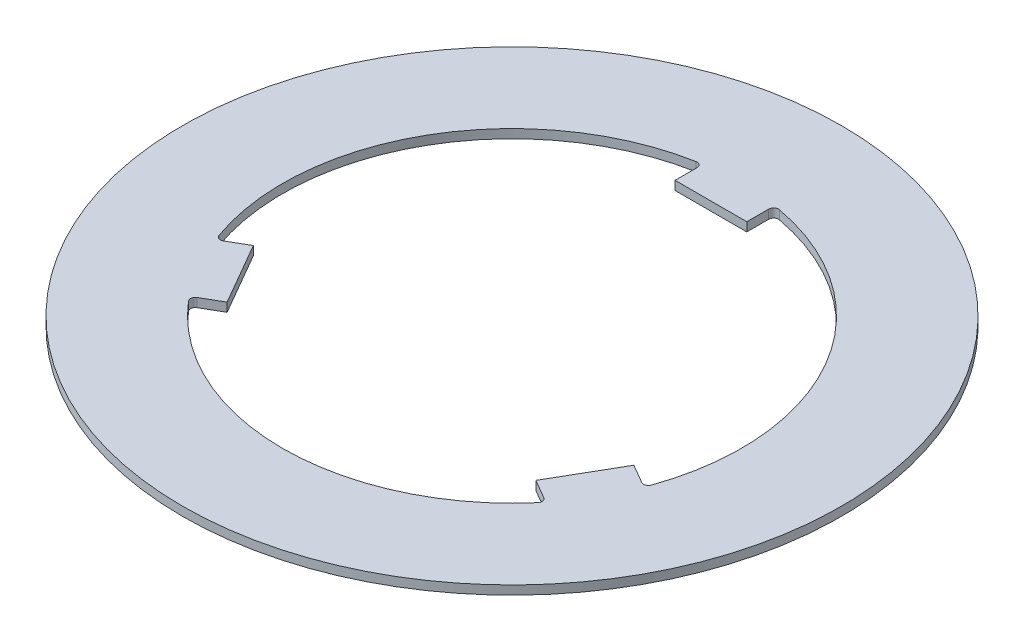
ISO-10303-21;
HEADER;
FILE_DESCRIPTION(('STEP AP214'),'2;1');
FILE_NAME('part.step','',(''),(''),'','','');
FILE_SCHEMA(('AUTOMOTIVE_DESIGN { 1 0 10303 214 1 1 1 1 }'));
ENDSEC;
DATA;
#1=APPLICATION_CONTEXT('core data for automotive mechanical design processes');
#2=APPLICATION_PROTOCOL_DEFINITION('international standard','automotive_design',2000,#1);
#3=PRODUCT_CONTEXT('',#1,'mechanical');
#4=PRODUCT('Part','Part','',(#3));
#5=PRODUCT_RELATED_PRODUCT_CATEGORY('part','',(#4));
#6=PRODUCT_DEFINITION_FORMATION('','',#4);
#7=PRODUCT_DEFINITION_CONTEXT('part definition',#1,'design');
#8=PRODUCT_DEFINITION('design','',#6,#7);
#9=PRODUCT_DEFINITION_SHAPE('','',#8);
#10=(LENGTH_UNIT() NAMED_UNIT(*) SI_UNIT(.MILLI.,.METRE.));
#11=(NAMED_UNIT(*) PLANE_ANGLE_UNIT() SI_UNIT($,.RADIAN.));
#12=(NAMED_UNIT(*) SI_UNIT($,.STERADIAN.) SOLID_ANGLE_UNIT());
#13=UNCERTAINTY_MEASURE_WITH_UNIT(LENGTH_MEASURE(1.E-05),#10,'distance_accuracy_value','');
#14=(GEOMETRIC_REPRESENTATION_CONTEXT(3) GLOBAL_UNCERTAINTY_ASSIGNED_CONTEXT((#13)) GLOBAL_UNIT_ASSIGNED_CONTEXT((#10,
#11,#12)) REPRESENTATION_CONTEXT('',''));
#15=CARTESIAN_POINT('',(0.,0.,0.));
#16=DIRECTION('',(0.,0.,1.));
#17=DIRECTION('',(1.,0.,0.));
#18=AXIS2_PLACEMENT_3D('',#15,#16,#17);
#19=CARTESIAN_POINT('',(0.,0.725,0.));
#20=DIRECTION('',(0.,-1.,0.));
#21=DIRECTION('',(0.,0.,-1.));
#22=AXIS2_PLACEMENT_3D('',#19,#20,#21);
#23=CYLINDRICAL_SURFACE('',#22,37.6);
#24=CARTESIAN_POINT('',(0.,-0.725,0.));
#25=DIRECTION('',(0.,1.,0.));
#26=DIRECTION('',(0.,0.,1.));
#27=AXIS2_PLACEMENT_3D('',#24,#25,#26);
#28=CIRCLE('',#27,37.6);
#29=CARTESIAN_POINT('',(-28.6123532448992,-0.725,24.3945330307654));
#30=VERTEX_POINT('',#29);
#31=CARTESIAN_POINT('',(28.6123532448989,-0.725,24.3945330307658));
#32=VERTEX_POINT('',#31);
#33=EDGE_CURVE('E237',#30,#32,#28,.T.);
#34=ORIENTED_EDGE('',*,*,#33,.F.);
#35=DIRECTION('',(0.,-1.,0.));
#36=VECTOR('',#35,1.);
#37=CARTESIAN_POINT('',(-28.6123532448992,0.725,24.3945330307654));
#38=LINE('',#37,#36);
#39=CARTESIAN_POINT('',(-28.6123532448992,0.725,24.3945330307654));
#40=VERTEX_POINT('',#39);
#41=EDGE_CURVE('E56',#30,#40,#38,.F.);
#42=ORIENTED_EDGE('',*,*,#41,.T.);
#43=CARTESIAN_POINT('',(0.,0.725,0.));
#44=DIRECTION('',(0.,1.,0.));
#45=DIRECTION('',(0.,0.,1.));
#46=AXIS2_PLACEMENT_3D('',#43,#44,#45);
#47=CIRCLE('',#46,37.6);
#48=CARTESIAN_POINT('',(28.6123532448989,0.725,24.3945330307658));
#49=VERTEX_POINT('',#48);
#50=EDGE_CURVE('E232',#40,#49,#47,.T.);
#51=ORIENTED_EDGE('',*,*,#50,.T.);
#52=DIRECTION('',(0.,-1.,0.));
#53=VECTOR('',#52,1.);
#54=CARTESIAN_POINT('',(28.6123532448989,0.725,24.3945330307658));
#55=LINE('',#54,#53);
#56=EDGE_CURVE('E262',#49,#32,#55,.T.);
#57=ORIENTED_EDGE('',*,*,#56,.T.);
#58=EDGE_LOOP('',(#34,#42,#51,#57));
#59=FACE_BOUND('',#58,.T.);
#60=ADVANCED_FACE('F35',(#59),#23,.F.);
#61=CARTESIAN_POINT('',(-6.82010869565217,0.725,-36.9762912875195));
#62=VERTEX_POINT('',#61);
#63=CARTESIAN_POINT('',(-35.4324619405513,0.725,12.5817582567535));
#64=VERTEX_POINT('',#63);
#65=EDGE_CURVE('E228',#62,#64,#47,.T.);
#66=ORIENTED_EDGE('',*,*,#65,.T.);
#67=DIRECTION('',(0.,-1.,0.));
#68=VECTOR('',#67,1.);
#69=CARTESIAN_POINT('',(-35.4324619405513,0.725,12.5817582567535));
#70=LINE('',#69,#68);
#71=CARTESIAN_POINT('',(-35.4324619405513,-0.725,12.5817582567535));
#72=VERTEX_POINT('',#71);
#73=EDGE_CURVE('E281',#64,#72,#70,.T.);
#74=ORIENTED_EDGE('',*,*,#73,.T.);
#75=CARTESIAN_POINT('',(-6.82010869565217,-0.725,-36.9762912875195));
#76=VERTEX_POINT('',#75);
#77=EDGE_CURVE('E234',#76,#72,#28,.T.);
#78=ORIENTED_EDGE('',*,*,#77,.F.);
#79=DIRECTION('',(0.,-1.,0.));
#80=VECTOR('',#79,1.);
#81=CARTESIAN_POINT('',(-6.82010869565217,0.725,-36.9762912875195));
#82=LINE('',#81,#80);
#83=EDGE_CURVE('E241',#76,#62,#82,.F.);
#84=ORIENTED_EDGE('',*,*,#83,.T.);
#85=EDGE_LOOP('',(#66,#74,#78,#84));
#86=FACE_BOUND('',#85,.T.);
#87=ADVANCED_FACE('F298',(#86),#23,.F.);
#88=CARTESIAN_POINT('',(35.4324619405511,-0.725,12.581758256754));
#89=VERTEX_POINT('',#88);
#90=CARTESIAN_POINT('',(6.82010869565217,-0.725,-36.9762912875195));
#91=VERTEX_POINT('',#90);
#92=EDGE_CURVE('E227',#89,#91,#28,.T.);
#93=ORIENTED_EDGE('',*,*,#92,.F.);
#94=DIRECTION('',(0.,-1.,0.));
#95=VECTOR('',#94,1.);
#96=CARTESIAN_POINT('',(35.4324619405511,0.725,12.581758256754));
#97=LINE('',#96,#95);
#98=CARTESIAN_POINT('',(35.4324619405511,0.725,12.581758256754));
#99=VERTEX_POINT('',#98);
#100=EDGE_CURVE('E270',#89,#99,#97,.F.);
#101=ORIENTED_EDGE('',*,*,#100,.T.);
#102=CARTESIAN_POINT('',(6.82010869565217,0.725,-36.9762912875195));
#103=VERTEX_POINT('',#102);
#104=EDGE_CURVE('E233',#99,#103,#47,.T.);
#105=ORIENTED_EDGE('',*,*,#104,.T.);
#106=DIRECTION('',(0.,-1.,0.));
#107=VECTOR('',#106,1.);
#108=CARTESIAN_POINT('',(6.82010869565217,0.725,-36.9762912875195));
#109=LINE('',#108,#107);
#110=EDGE_CURVE('E245',#103,#91,#109,.T.);
#111=ORIENTED_EDGE('',*,*,#110,.T.);
#112=EDGE_LOOP('',(#93,#101,#105,#111));
#113=FACE_BOUND('',#112,.T.);
#114=ADVANCED_FACE('F325',(#113),#23,.F.);
#115=CARTESIAN_POINT('',(0.,0.725,0.));
#116=DIRECTION('',(0.,1.,0.));
#117=DIRECTION('',(0.,0.,1.));
#118=AXIS2_PLACEMENT_3D('',#115,#116,#117);
#119=PLANE('',#118);
#120=CARTESIAN_POINT('',(0.,0.725,0.));
#121=DIRECTION('',(0.,1.,0.));
#122=DIRECTION('',(0.,0.,1.));
#123=AXIS2_PLACEMENT_3D('',#120,#121,#122);
#124=CIRCLE('',#123,54.);
#125=CARTESIAN_POINT('',(0.,0.725,54.));
#126=VERTEX_POINT('',#125);
#127=EDGE_CURVE('E238',#126,#126,#124,.T.);
#128=ORIENTED_EDGE('',*,*,#127,.T.);
#129=EDGE_LOOP('',(#128));
#130=FACE_BOUND('',#129,.T.);
#131=ORIENTED_EDGE('',*,*,#65,.F.);
#132=CARTESIAN_POINT('',(-6.675,0.725,-36.1895616856574));
#133=DIRECTION('',(0.,1.,0.));
#134=DIRECTION('',(0.,0.,1.));
#135=AXIS2_PLACEMENT_3D('',#132,#133,#134);
#136=CIRCLE('',#135,0.8);
#137=CARTESIAN_POINT('',(-5.875,0.725,-36.1895616856574));
#138=VERTEX_POINT('',#137);
#139=EDGE_CURVE('E260',#62,#138,#136,.F.);
#140=ORIENTED_EDGE('',*,*,#139,.T.);
#141=DIRECTION('',(0.,0.,1.));
#142=VECTOR('',#141,1.);
#143=CARTESIAN_POINT('',(-5.875,0.725,-32.6));
#144=LINE('',#143,#142);
#145=CARTESIAN_POINT('',(-5.875,0.725,-32.6));
#146=VERTEX_POINT('',#145);
#147=EDGE_CURVE('E208',#138,#146,#144,.T.);
#148=ORIENTED_EDGE('',*,*,#147,.T.);
#149=DIRECTION('',(1.,0.,0.));
#150=VECTOR('',#149,1.);
#151=CARTESIAN_POINT('',(-5.875,0.725,-32.6));
#152=LINE('',#151,#150);
#153=CARTESIAN_POINT('',(5.875,0.725,-32.6));
#154=VERTEX_POINT('',#153);
#155=EDGE_CURVE('E210',#146,#154,#152,.T.);
#156=ORIENTED_EDGE('',*,*,#155,.T.);
#157=DIRECTION('',(0.,0.,-1.));
#158=VECTOR('',#157,1.);
#159=CARTESIAN_POINT('',(5.875,0.725,-32.6));
#160=LINE('',#159,#158);
#161=CARTESIAN_POINT('',(5.875,0.725,-36.1895616856574));
#162=VERTEX_POINT('',#161);
#163=EDGE_CURVE('E213',#154,#162,#160,.T.);
#164=ORIENTED_EDGE('',*,*,#163,.T.);
#165=CARTESIAN_POINT('',(6.675,0.725,-36.1895616856574));
#166=DIRECTION('',(0.,1.,0.));
#167=DIRECTION('',(0.,0.,1.));
#168=AXIS2_PLACEMENT_3D('',#165,#166,#167);
#169=CIRCLE('',#168,0.8);
#170=EDGE_CURVE('E255',#162,#103,#169,.F.);
#171=ORIENTED_EDGE('',*,*,#170,.T.);
#172=ORIENTED_EDGE('',*,*,#104,.F.);
#173=CARTESIAN_POINT('',(34.6785797716032,0.725,12.3140612725677));
#174=DIRECTION('',(0.,1.,0.));
#175=DIRECTION('',(0.,0.,1.));
#176=AXIS2_PLACEMENT_3D('',#173,#174,#175);
#177=CIRCLE('',#176,0.8);
#178=CARTESIAN_POINT('',(34.2785797716032,0.725,13.0068815955953));
#179=VERTEX_POINT('',#178);
#180=EDGE_CURVE('E279',#99,#179,#177,.F.);
#181=ORIENTED_EDGE('',*,*,#180,.T.);
#182=DIRECTION('',(-0.866025403784436,0.,-0.500000000000004));
#183=VECTOR('',#182,1.);
#184=CARTESIAN_POINT('',(31.1699281633726,0.725,11.2121007527666));
#185=LINE('',#184,#183);
#186=CARTESIAN_POINT('',(31.1699281633726,0.725,11.2121007527666));
#187=VERTEX_POINT('',#186);
#188=EDGE_CURVE('E190',#179,#187,#185,.T.);
#189=ORIENTED_EDGE('',*,*,#188,.T.);
#190=DIRECTION('',(-0.500000000000004,0.,0.866025403784436));
#191=VECTOR('',#190,1.);
#192=CARTESIAN_POINT('',(31.1699281633726,0.725,11.2121007527666));
#193=LINE('',#192,#191);
#194=CARTESIAN_POINT('',(25.2949281633726,0.725,21.3878992472337));
#195=VERTEX_POINT('',#194);
#196=EDGE_CURVE('E192',#187,#195,#193,.T.);
#197=ORIENTED_EDGE('',*,*,#196,.T.);
#198=DIRECTION('',(0.866025403784436,0.,0.500000000000004));
#199=VECTOR('',#198,1.);
#200=CARTESIAN_POINT('',(25.2949281633726,0.725,21.3878992472337));
#201=LINE('',#200,#199);
#202=CARTESIAN_POINT('',(28.4035797716032,0.725,23.1826800900624));
#203=VERTEX_POINT('',#202);
#204=EDGE_CURVE('E195',#195,#203,#201,.T.);
#205=ORIENTED_EDGE('',*,*,#204,.T.);
#206=CARTESIAN_POINT('',(28.0035797716032,0.725,23.8755004130899));
#207=DIRECTION('',(0.,1.,0.));
#208=DIRECTION('',(0.,0.,1.));
#209=AXIS2_PLACEMENT_3D('',#206,#207,#208);
#210=CIRCLE('',#209,0.8);
#211=EDGE_CURVE('E274',#203,#49,#210,.F.);
#212=ORIENTED_EDGE('',*,*,#211,.T.);
#213=ORIENTED_EDGE('',*,*,#50,.F.);
#214=CARTESIAN_POINT('',(-28.0035797716035,0.725,23.8755004130896));
#215=DIRECTION('',(0.,1.,0.));
#216=DIRECTION('',(0.,0.,1.));
#217=AXIS2_PLACEMENT_3D('',#214,#215,#216);
#218=CIRCLE('',#217,0.8);
#219=CARTESIAN_POINT('',(-28.4035797716035,0.725,23.182680090062));
#220=VERTEX_POINT('',#219);
#221=EDGE_CURVE('E11',#40,#220,#218,.F.);
#222=ORIENTED_EDGE('',*,*,#221,.T.);
#223=DIRECTION('',(0.866025403784443,0.,-0.499999999999992));
#224=VECTOR('',#223,1.);
#225=CARTESIAN_POINT('',(-25.2949281633729,0.725,21.3878992472333));
#226=LINE('',#225,#224);
#227=CARTESIAN_POINT('',(-25.2949281633729,0.725,21.3878992472333));
#228=VERTEX_POINT('',#227);
#229=EDGE_CURVE('E157',#220,#228,#226,.T.);
#230=ORIENTED_EDGE('',*,*,#229,.T.);
#231=DIRECTION('',(-0.499999999999992,0.,-0.866025403784443));
#232=VECTOR('',#231,1.);
#233=CARTESIAN_POINT('',(-25.2949281633729,0.725,21.3878992472333));
#234=LINE('',#233,#232);
#235=CARTESIAN_POINT('',(-31.1699281633728,0.725,11.2121007527661));
#236=VERTEX_POINT('',#235);
#237=EDGE_CURVE('E162',#228,#236,#234,.T.);
#238=ORIENTED_EDGE('',*,*,#237,.T.);
#239=DIRECTION('',(-0.866025403784443,0.,0.499999999999992));
#240=VECTOR('',#239,1.);
#241=CARTESIAN_POINT('',(-31.1699281633728,0.725,11.2121007527661));
#242=LINE('',#241,#240);
#243=CARTESIAN_POINT('',(-34.2785797716034,0.725,13.0068815955948));
#244=VERTEX_POINT('',#243);
#245=EDGE_CURVE('E178',#236,#244,#242,.T.);
#246=ORIENTED_EDGE('',*,*,#245,.T.);
#247=CARTESIAN_POINT('',(-34.6785797716034,0.725,12.3140612725672));
#248=DIRECTION('',(0.,1.,0.));
#249=DIRECTION('',(0.,0.,1.));
#250=AXIS2_PLACEMENT_3D('',#247,#248,#249);
#251=CIRCLE('',#250,0.8);
#252=EDGE_CURVE('E291',#244,#64,#251,.F.);
#253=ORIENTED_EDGE('',*,*,#252,.T.);
#254=EDGE_LOOP('',(#131,#140,#148,#156,#164,#171,#172,#181,#189,#197,#205,#212,#213,#222,#230,
#238,#246,#253));
#255=FACE_BOUND('',#254,.T.);
#256=ADVANCED_FACE('F160',(#130,#255),#119,.T.);
#257=CARTESIAN_POINT('',(0.,-0.725,0.));
#258=DIRECTION('',(0.,1.,0.));
#259=DIRECTION('',(0.,0.,1.));
#260=AXIS2_PLACEMENT_3D('',#257,#258,#259);
#261=PLANE('',#260);
#262=CARTESIAN_POINT('',(0.,-0.725,0.));
#263=DIRECTION('',(0.,1.,0.));
#264=DIRECTION('',(0.,0.,1.));
#265=AXIS2_PLACEMENT_3D('',#262,#263,#264);
#266=CIRCLE('',#265,54.);
#267=CARTESIAN_POINT('',(0.,-0.725,54.));
#268=VERTEX_POINT('',#267);
#269=EDGE_CURVE('E231',#268,#268,#266,.T.);
#270=ORIENTED_EDGE('',*,*,#269,.F.);
#271=EDGE_LOOP('',(#270));
#272=FACE_BOUND('',#271,.T.);
#273=DIRECTION('',(0.,0.,1.));
#274=VECTOR('',#273,1.);
#275=CARTESIAN_POINT('',(-5.875,-0.725,-32.6));
#276=LINE('',#275,#274);
#277=CARTESIAN_POINT('',(-5.875,-0.725,-36.1895616856574));
#278=VERTEX_POINT('',#277);
#279=CARTESIAN_POINT('',(-5.875,-0.725,-32.6));
#280=VERTEX_POINT('',#279);
#281=EDGE_CURVE('E207',#278,#280,#276,.T.);
#282=ORIENTED_EDGE('',*,*,#281,.F.);
#283=CARTESIAN_POINT('',(-6.675,-0.725,-36.1895616856574));
#284=DIRECTION('',(0.,1.,0.));
#285=DIRECTION('',(0.,0.,1.));
#286=AXIS2_PLACEMENT_3D('',#283,#284,#285);
#287=CIRCLE('',#286,0.8);
#288=EDGE_CURVE('E258',#278,#76,#287,.T.);
#289=ORIENTED_EDGE('',*,*,#288,.T.);
#290=ORIENTED_EDGE('',*,*,#77,.T.);
#291=CARTESIAN_POINT('',(-34.6785797716034,-0.725,12.3140612725672));
#292=DIRECTION('',(0.,1.,0.));
#293=DIRECTION('',(0.,0.,1.));
#294=AXIS2_PLACEMENT_3D('',#291,#292,#293);
#295=CIRCLE('',#294,0.8);
#296=CARTESIAN_POINT('',(-34.2785797716034,-0.725,13.0068815955948));
#297=VERTEX_POINT('',#296);
#298=EDGE_CURVE('E289',#72,#297,#295,.T.);
#299=ORIENTED_EDGE('',*,*,#298,.T.);
#300=DIRECTION('',(-0.866025403784443,0.,0.499999999999992));
#301=VECTOR('',#300,1.);
#302=CARTESIAN_POINT('',(-31.1699281633728,-0.725,11.2121007527661));
#303=LINE('',#302,#301);
#304=CARTESIAN_POINT('',(-31.1699281633728,-0.725,11.2121007527661));
#305=VERTEX_POINT('',#304);
#306=EDGE_CURVE('E169',#305,#297,#303,.T.);
#307=ORIENTED_EDGE('',*,*,#306,.F.);
#308=DIRECTION('',(-0.499999999999992,0.,-0.866025403784443));
#309=VECTOR('',#308,1.);
#310=CARTESIAN_POINT('',(-25.2949281633729,-0.725,21.3878992472333));
#311=LINE('',#310,#309);
#312=CARTESIAN_POINT('',(-25.2949281633729,-0.725,21.3878992472333));
#313=VERTEX_POINT('',#312);
#314=EDGE_CURVE('E308',#313,#305,#311,.T.);
#315=ORIENTED_EDGE('',*,*,#314,.F.);
#316=DIRECTION('',(0.866025403784443,0.,-0.499999999999992));
#317=VECTOR('',#316,1.);
#318=CARTESIAN_POINT('',(-25.2949281633729,-0.725,21.3878992472333));
#319=LINE('',#318,#317);
#320=CARTESIAN_POINT('',(-28.4035797716035,-0.725,23.182680090062));
#321=VERTEX_POINT('',#320);
#322=EDGE_CURVE('E181',#321,#313,#319,.T.);
#323=ORIENTED_EDGE('',*,*,#322,.F.);
#324=CARTESIAN_POINT('',(-28.0035797716035,-0.725,23.8755004130896));
#325=DIRECTION('',(0.,1.,0.));
#326=DIRECTION('',(0.,0.,1.));
#327=AXIS2_PLACEMENT_3D('',#324,#325,#326);
#328=CIRCLE('',#327,0.8);
#329=EDGE_CURVE('E43',#321,#30,#328,.T.);
#330=ORIENTED_EDGE('',*,*,#329,.T.);
#331=ORIENTED_EDGE('',*,*,#33,.T.);
#332=CARTESIAN_POINT('',(28.0035797716032,-0.725,23.8755004130899));
#333=DIRECTION('',(0.,1.,0.));
#334=DIRECTION('',(0.,0.,1.));
#335=AXIS2_PLACEMENT_3D('',#332,#333,#334);
#336=CIRCLE('',#335,0.8);
#337=CARTESIAN_POINT('',(28.4035797716032,-0.725,23.1826800900624));
#338=VERTEX_POINT('',#337);
#339=EDGE_CURVE('E272',#32,#338,#336,.T.);
#340=ORIENTED_EDGE('',*,*,#339,.T.);
#341=DIRECTION('',(0.866025403784436,0.,0.500000000000004));
#342=VECTOR('',#341,1.);
#343=CARTESIAN_POINT('',(25.2949281633726,-0.725,21.3878992472337));
#344=LINE('',#343,#342);
#345=CARTESIAN_POINT('',(25.2949281633726,-0.725,21.3878992472337));
#346=VERTEX_POINT('',#345);
#347=EDGE_CURVE('E193',#346,#338,#344,.T.);
#348=ORIENTED_EDGE('',*,*,#347,.F.);
#349=DIRECTION('',(-0.500000000000004,0.,0.866025403784436));
#350=VECTOR('',#349,1.);
#351=CARTESIAN_POINT('',(31.1699281633726,-0.725,11.2121007527666));
#352=LINE('',#351,#350);
#353=CARTESIAN_POINT('',(31.1699281633726,-0.725,11.2121007527666));
#354=VERTEX_POINT('',#353);
#355=EDGE_CURVE('E185',#354,#346,#352,.T.);
#356=ORIENTED_EDGE('',*,*,#355,.F.);
#357=DIRECTION('',(-0.866025403784436,0.,-0.500000000000004));
#358=VECTOR('',#357,1.);
#359=CARTESIAN_POINT('',(31.1699281633726,-0.725,11.2121007527666));
#360=LINE('',#359,#358);
#361=CARTESIAN_POINT('',(34.2785797716032,-0.725,13.0068815955953));
#362=VERTEX_POINT('',#361);
#363=EDGE_CURVE('E183',#362,#354,#360,.T.);
#364=ORIENTED_EDGE('',*,*,#363,.F.);
#365=CARTESIAN_POINT('',(34.6785797716032,-0.725,12.3140612725677));
#366=DIRECTION('',(0.,1.,0.));
#367=DIRECTION('',(0.,0.,1.));
#368=AXIS2_PLACEMENT_3D('',#365,#366,#367);
#369=CIRCLE('',#368,0.8);
#370=EDGE_CURVE('E277',#362,#89,#369,.T.);
#371=ORIENTED_EDGE('',*,*,#370,.T.);
#372=ORIENTED_EDGE('',*,*,#92,.T.);
#373=CARTESIAN_POINT('',(6.675,-0.725,-36.1895616856574));
#374=DIRECTION('',(0.,1.,0.));
#375=DIRECTION('',(0.,0.,1.));
#376=AXIS2_PLACEMENT_3D('',#373,#374,#375);
#377=CIRCLE('',#376,0.8);
#378=CARTESIAN_POINT('',(5.875,-0.725,-36.1895616856574));
#379=VERTEX_POINT('',#378);
#380=EDGE_CURVE('E253',#91,#379,#377,.T.);
#381=ORIENTED_EDGE('',*,*,#380,.T.);
#382=DIRECTION('',(0.,0.,-1.));
#383=VECTOR('',#382,1.);
#384=CARTESIAN_POINT('',(5.875,-0.725,-32.6));
#385=LINE('',#384,#383);
#386=CARTESIAN_POINT('',(5.875,-0.725,-32.6));
#387=VERTEX_POINT('',#386);
#388=EDGE_CURVE('E211',#387,#379,#385,.T.);
#389=ORIENTED_EDGE('',*,*,#388,.F.);
#390=DIRECTION('',(1.,0.,0.));
#391=VECTOR('',#390,1.);
#392=CARTESIAN_POINT('',(-5.875,-0.725,-32.6));
#393=LINE('',#392,#391);
#394=EDGE_CURVE('E218',#280,#387,#393,.T.);
#395=ORIENTED_EDGE('',*,*,#394,.F.);
#396=EDGE_LOOP('',(#282,#289,#290,#299,#307,#315,#323,#330,#331,#340,#348,#356,#364,#371,#372,
#381,#389,#395));
#397=FACE_BOUND('',#396,.T.);
#398=ADVANCED_FACE('F305',(#272,#397),#261,.F.);
#399=CARTESIAN_POINT('',(0.,0.725,0.));
#400=DIRECTION('',(0.,-1.,0.));
#401=DIRECTION('',(0.,0.,-1.));
#402=AXIS2_PLACEMENT_3D('',#399,#400,#401);
#403=CYLINDRICAL_SURFACE('',#402,54.);
#404=ORIENTED_EDGE('',*,*,#127,.F.);
#405=EDGE_LOOP('',(#404));
#406=FACE_BOUND('',#405,.T.);
#407=ORIENTED_EDGE('',*,*,#269,.T.);
#408=EDGE_LOOP('',(#407));
#409=FACE_BOUND('',#408,.T.);
#410=ADVANCED_FACE('F465',(#406,#409),#403,.T.);
#411=CARTESIAN_POINT('',(-5.875,0.725,-32.6));
#412=DIRECTION('',(1.,0.,0.));
#413=DIRECTION('',(0.,0.,-1.));
#414=AXIS2_PLACEMENT_3D('',#411,#412,#413);
#415=PLANE('',#414);
#416=ORIENTED_EDGE('',*,*,#147,.F.);
#417=DIRECTION('',(0.,-1.,0.));
#418=VECTOR('',#417,1.);
#419=CARTESIAN_POINT('',(-5.875,0.725,-36.1895616856574));
#420=LINE('',#419,#418);
#421=EDGE_CURVE('E250',#138,#278,#420,.T.);
#422=ORIENTED_EDGE('',*,*,#421,.T.);
#423=ORIENTED_EDGE('',*,*,#281,.T.);
#424=DIRECTION('',(0.,-1.,0.));
#425=VECTOR('',#424,1.);
#426=CARTESIAN_POINT('',(-5.875,0.725,-32.6));
#427=LINE('',#426,#425);
#428=EDGE_CURVE('E224',#146,#280,#427,.T.);
#429=ORIENTED_EDGE('',*,*,#428,.F.);
#430=EDGE_LOOP('',(#416,#422,#423,#429));
#431=FACE_BOUND('',#430,.T.);
#432=ADVANCED_FACE('F377',(#431),#415,.F.);
#433=CARTESIAN_POINT('',(-5.875,0.725,-32.6));
#434=DIRECTION('',(0.,0.,-1.));
#435=DIRECTION('',(-1.,0.,0.));
#436=AXIS2_PLACEMENT_3D('',#433,#434,#435);
#437=PLANE('',#436);
#438=ORIENTED_EDGE('',*,*,#394,.T.);
#439=DIRECTION('',(0.,-1.,0.));
#440=VECTOR('',#439,1.);
#441=CARTESIAN_POINT('',(5.875,0.725,-32.6));
#442=LINE('',#441,#440);
#443=EDGE_CURVE('E216',#154,#387,#442,.T.);
#444=ORIENTED_EDGE('',*,*,#443,.F.);
#445=ORIENTED_EDGE('',*,*,#155,.F.);
#446=ORIENTED_EDGE('',*,*,#428,.T.);
#447=EDGE_LOOP('',(#438,#444,#445,#446));
#448=FACE_BOUND('',#447,.T.);
#449=ADVANCED_FACE('F373',(#448),#437,.F.);
#450=CARTESIAN_POINT('',(5.875,0.725,-32.6));
#451=DIRECTION('',(-1.,0.,0.));
#452=DIRECTION('',(0.,0.,1.));
#453=AXIS2_PLACEMENT_3D('',#450,#451,#452);
#454=PLANE('',#453);
#455=ORIENTED_EDGE('',*,*,#388,.T.);
#456=DIRECTION('',(0.,-1.,0.));
#457=VECTOR('',#456,1.);
#458=CARTESIAN_POINT('',(5.875,0.725,-36.1895616856574));
#459=LINE('',#458,#457);
#460=EDGE_CURVE('E248',#379,#162,#459,.F.);
#461=ORIENTED_EDGE('',*,*,#460,.T.);
#462=ORIENTED_EDGE('',*,*,#163,.F.);
#463=ORIENTED_EDGE('',*,*,#443,.T.);
#464=EDGE_LOOP('',(#455,#461,#462,#463));
#465=FACE_BOUND('',#464,.T.);
#466=ADVANCED_FACE('F369',(#465),#454,.F.);
#467=CARTESIAN_POINT('',(6.675,0.725,-36.1895616856574));
#468=DIRECTION('',(0.,-1.,0.));
#469=DIRECTION('',(0.,0.,-1.));
#470=AXIS2_PLACEMENT_3D('',#467,#468,#469);
#471=CYLINDRICAL_SURFACE('',#470,0.8);
#472=ORIENTED_EDGE('',*,*,#170,.F.);
#473=ORIENTED_EDGE('',*,*,#460,.F.);
#474=ORIENTED_EDGE('',*,*,#380,.F.);
#475=ORIENTED_EDGE('',*,*,#110,.F.);
#476=EDGE_LOOP('',(#472,#473,#474,#475));
#477=FACE_BOUND('',#476,.T.);
#478=ADVANCED_FACE('F365',(#477),#471,.F.);
#479=CARTESIAN_POINT('',(-6.675,0.725,-36.1895616856574));
#480=DIRECTION('',(0.,-1.,0.));
#481=DIRECTION('',(0.,0.,-1.));
#482=AXIS2_PLACEMENT_3D('',#479,#480,#481);
#483=CYLINDRICAL_SURFACE('',#482,0.8);
#484=ORIENTED_EDGE('',*,*,#139,.F.);
#485=ORIENTED_EDGE('',*,*,#83,.F.);
#486=ORIENTED_EDGE('',*,*,#288,.F.);
#487=ORIENTED_EDGE('',*,*,#421,.F.);
#488=EDGE_LOOP('',(#484,#485,#486,#487));
#489=FACE_BOUND('',#488,.T.);
#490=ADVANCED_FACE('F380',(#489),#483,.F.);
#491=CARTESIAN_POINT('',(31.1699281633726,0.725,11.2121007527666));
#492=DIRECTION('',(-0.500000000000004,0.,0.866025403784436));
#493=DIRECTION('',(0.866025403784436,0.,0.500000000000004));
#494=AXIS2_PLACEMENT_3D('',#491,#492,#493);
#495=PLANE('',#494);
#496=ORIENTED_EDGE('',*,*,#188,.F.);
#497=DIRECTION('',(0.,-1.,0.));
#498=VECTOR('',#497,1.);
#499=CARTESIAN_POINT('',(34.2785797716032,0.725,13.0068815955953));
#500=LINE('',#499,#498);
#501=EDGE_CURVE('E267',#179,#362,#500,.T.);
#502=ORIENTED_EDGE('',*,*,#501,.T.);
#503=ORIENTED_EDGE('',*,*,#363,.T.);
#504=DIRECTION('',(0.,-1.,0.));
#505=VECTOR('',#504,1.);
#506=CARTESIAN_POINT('',(31.1699281633726,0.725,11.2121007527666));
#507=LINE('',#506,#505);
#508=EDGE_CURVE('E204',#187,#354,#507,.T.);
#509=ORIENTED_EDGE('',*,*,#508,.F.);
#510=EDGE_LOOP('',(#496,#502,#503,#509));
#511=FACE_BOUND('',#510,.T.);
#512=ADVANCED_FACE('F349',(#511),#495,.F.);
#513=CARTESIAN_POINT('',(31.1699281633726,0.725,11.2121007527666));
#514=DIRECTION('',(0.866025403784436,0.,0.500000000000004));
#515=DIRECTION('',(0.500000000000004,0.,-0.866025403784436));
#516=AXIS2_PLACEMENT_3D('',#513,#514,#515);
#517=PLANE('',#516);
#518=ORIENTED_EDGE('',*,*,#355,.T.);
#519=DIRECTION('',(0.,-1.,0.));
#520=VECTOR('',#519,1.);
#521=CARTESIAN_POINT('',(25.2949281633726,0.725,21.3878992472337));
#522=LINE('',#521,#520);
#523=EDGE_CURVE('E197',#195,#346,#522,.T.);
#524=ORIENTED_EDGE('',*,*,#523,.F.);
#525=ORIENTED_EDGE('',*,*,#196,.F.);
#526=ORIENTED_EDGE('',*,*,#508,.T.);
#527=EDGE_LOOP('',(#518,#524,#525,#526));
#528=FACE_BOUND('',#527,.T.);
#529=ADVANCED_FACE('F353',(#528),#517,.F.);
#530=CARTESIAN_POINT('',(25.2949281633726,0.725,21.3878992472337));
#531=DIRECTION('',(0.500000000000004,0.,-0.866025403784436));
#532=DIRECTION('',(-0.866025403784437,0.,-0.500000000000004));
#533=AXIS2_PLACEMENT_3D('',#530,#531,#532);
#534=PLANE('',#533);
#535=ORIENTED_EDGE('',*,*,#347,.T.);
#536=DIRECTION('',(0.,-1.,0.));
#537=VECTOR('',#536,1.);
#538=CARTESIAN_POINT('',(28.4035797716032,0.725,23.1826800900624));
#539=LINE('',#538,#537);
#540=EDGE_CURVE('E265',#338,#203,#539,.F.);
#541=ORIENTED_EDGE('',*,*,#540,.T.);
#542=ORIENTED_EDGE('',*,*,#204,.F.);
#543=ORIENTED_EDGE('',*,*,#523,.T.);
#544=EDGE_LOOP('',(#535,#541,#542,#543));
#545=FACE_BOUND('',#544,.T.);
#546=ADVANCED_FACE('F434',(#545),#534,.F.);
#547=CARTESIAN_POINT('',(-25.2949281633729,0.725,21.3878992472333));
#548=DIRECTION('',(-0.499999999999992,0.,-0.866025403784443));
#549=DIRECTION('',(-0.866025403784443,0.,0.499999999999992));
#550=AXIS2_PLACEMENT_3D('',#547,#548,#549);
#551=PLANE('',#550);
#552=ORIENTED_EDGE('',*,*,#229,.F.);
#553=DIRECTION('',(0.,-1.,0.));
#554=VECTOR('',#553,1.);
#555=CARTESIAN_POINT('',(-28.4035797716035,0.725,23.182680090062));
#556=LINE('',#555,#554);
#557=EDGE_CURVE('E286',#220,#321,#556,.T.);
#558=ORIENTED_EDGE('',*,*,#557,.T.);
#559=ORIENTED_EDGE('',*,*,#322,.T.);
#560=DIRECTION('',(0.,-1.,0.));
#561=VECTOR('',#560,1.);
#562=CARTESIAN_POINT('',(-25.2949281633729,0.725,21.3878992472333));
#563=LINE('',#562,#561);
#564=EDGE_CURVE('E174',#228,#313,#563,.T.);
#565=ORIENTED_EDGE('',*,*,#564,.F.);
#566=EDGE_LOOP('',(#552,#558,#559,#565));
#567=FACE_BOUND('',#566,.T.);
#568=ADVANCED_FACE('F180',(#567),#551,.F.);
#569=CARTESIAN_POINT('',(-25.2949281633729,0.725,21.3878992472333));
#570=DIRECTION('',(-0.866025403784443,0.,0.499999999999992));
#571=DIRECTION('',(0.499999999999992,0.,0.866025403784443));
#572=AXIS2_PLACEMENT_3D('',#569,#570,#571);
#573=PLANE('',#572);
#574=ORIENTED_EDGE('',*,*,#314,.T.);
#575=DIRECTION('',(0.,-1.,0.));
#576=VECTOR('',#575,1.);
#577=CARTESIAN_POINT('',(-31.1699281633728,0.725,11.2121007527661));
#578=LINE('',#577,#576);
#579=EDGE_CURVE('E176',#236,#305,#578,.T.);
#580=ORIENTED_EDGE('',*,*,#579,.F.);
#581=ORIENTED_EDGE('',*,*,#237,.F.);
#582=ORIENTED_EDGE('',*,*,#564,.T.);
#583=EDGE_LOOP('',(#574,#580,#581,#582));
#584=FACE_BOUND('',#583,.T.);
#585=ADVANCED_FACE('F173',(#584),#573,.F.);
#586=CARTESIAN_POINT('',(-31.1699281633728,0.725,11.2121007527661));
#587=DIRECTION('',(0.499999999999992,0.,0.866025403784443));
#588=DIRECTION('',(0.866025403784443,0.,-0.499999999999992));
#589=AXIS2_PLACEMENT_3D('',#586,#587,#588);
#590=PLANE('',#589);
#591=ORIENTED_EDGE('',*,*,#306,.T.);
#592=DIRECTION('',(0.,-1.,0.));
#593=VECTOR('',#592,1.);
#594=CARTESIAN_POINT('',(-34.2785797716034,0.725,13.0068815955948));
#595=LINE('',#594,#593);
#596=EDGE_CURVE('E284',#297,#244,#595,.F.);
#597=ORIENTED_EDGE('',*,*,#596,.T.);
#598=ORIENTED_EDGE('',*,*,#245,.F.);
#599=ORIENTED_EDGE('',*,*,#579,.T.);
#600=EDGE_LOOP('',(#591,#597,#598,#599));
#601=FACE_BOUND('',#600,.T.);
#602=ADVANCED_FACE('F307',(#601),#590,.F.);
#603=CARTESIAN_POINT('',(28.0035797716032,0.725,23.8755004130899));
#604=DIRECTION('',(0.,-1.,0.));
#605=DIRECTION('',(0.,0.,-1.));
#606=AXIS2_PLACEMENT_3D('',#603,#604,#605);
#607=CYLINDRICAL_SURFACE('',#606,0.8);
#608=ORIENTED_EDGE('',*,*,#211,.F.);
#609=ORIENTED_EDGE('',*,*,#540,.F.);
#610=ORIENTED_EDGE('',*,*,#339,.F.);
#611=ORIENTED_EDGE('',*,*,#56,.F.);
#612=EDGE_LOOP('',(#608,#609,#610,#611));
#613=FACE_BOUND('',#612,.T.);
#614=ADVANCED_FACE('F313',(#613),#607,.F.);
#615=CARTESIAN_POINT('',(34.6785797716032,0.725,12.3140612725677));
#616=DIRECTION('',(0.,-1.,0.));
#617=DIRECTION('',(0.,0.,-1.));
#618=AXIS2_PLACEMENT_3D('',#615,#616,#617);
#619=CYLINDRICAL_SURFACE('',#618,0.8);
#620=ORIENTED_EDGE('',*,*,#180,.F.);
#621=ORIENTED_EDGE('',*,*,#100,.F.);
#622=ORIENTED_EDGE('',*,*,#370,.F.);
#623=ORIENTED_EDGE('',*,*,#501,.F.);
#624=EDGE_LOOP('',(#620,#621,#622,#623));
#625=FACE_BOUND('',#624,.T.);
#626=ADVANCED_FACE('F319',(#625),#619,.F.);
#627=CARTESIAN_POINT('',(-34.6785797716034,0.725,12.3140612725672));
#628=DIRECTION('',(0.,-1.,0.));
#629=DIRECTION('',(0.,0.,-1.));
#630=AXIS2_PLACEMENT_3D('',#627,#628,#629);
#631=CYLINDRICAL_SURFACE('',#630,0.8);
#632=ORIENTED_EDGE('',*,*,#252,.F.);
#633=ORIENTED_EDGE('',*,*,#596,.F.);
#634=ORIENTED_EDGE('',*,*,#298,.F.);
#635=ORIENTED_EDGE('',*,*,#73,.F.);
#636=EDGE_LOOP('',(#632,#633,#634,#635));
#637=FACE_BOUND('',#636,.T.);
#638=ADVANCED_FACE('F301',(#637),#631,.F.);
#639=CARTESIAN_POINT('',(-28.0035797716035,0.725,23.8755004130896));
#640=DIRECTION('',(0.,-1.,0.));
#641=DIRECTION('',(0.,0.,-1.));
#642=AXIS2_PLACEMENT_3D('',#639,#640,#641);
#643=CYLINDRICAL_SURFACE('',#642,0.8);
#644=ORIENTED_EDGE('',*,*,#221,.F.);
#645=ORIENTED_EDGE('',*,*,#41,.F.);
#646=ORIENTED_EDGE('',*,*,#329,.F.);
#647=ORIENTED_EDGE('',*,*,#557,.F.);
#648=EDGE_LOOP('',(#644,#645,#646,#647));
#649=FACE_BOUND('',#648,.T.);
#650=ADVANCED_FACE('F37',(#649),#643,.F.);
#651=CLOSED_SHELL('',(#60,#87,#114,#256,#398,#410,#432,#449,#466,#478,#490,#512,#529,#546,#568,
#585,#602,#614,#626,#638,#650));
#652=MANIFOLD_SOLID_BREP('B2',#651);
#653=ADVANCED_BREP_SHAPE_REPRESENTATION('',(#18,#652),#14);
#654=SHAPE_DEFINITION_REPRESENTATION(#9,#653);
ENDSEC;
END-ISO-10303-21;
